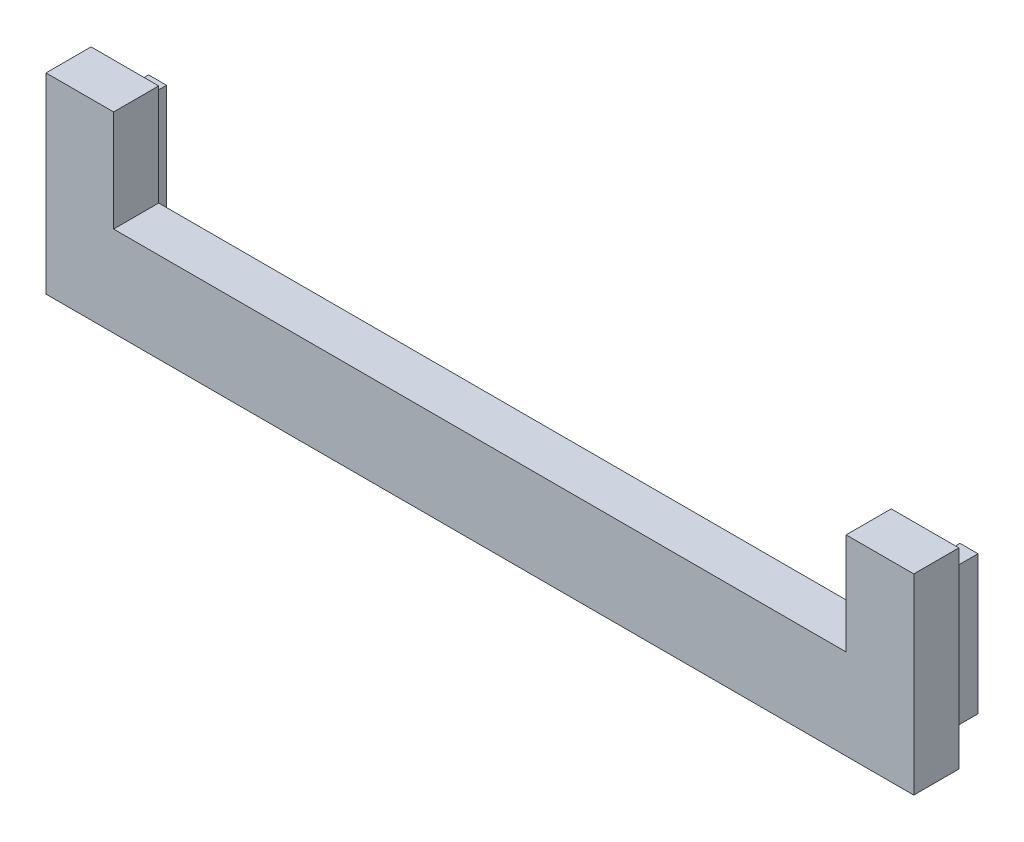
ISO-10303-21;
HEADER;
FILE_DESCRIPTION(('STEP AP214'),'2;1');
FILE_NAME('part.step','',(''),(''),'','','');
FILE_SCHEMA(('AUTOMOTIVE_DESIGN { 1 0 10303 214 1 1 1 1 }'));
ENDSEC;
DATA;
#1=APPLICATION_CONTEXT('core data for automotive mechanical design processes');
#2=APPLICATION_PROTOCOL_DEFINITION('international standard','automotive_design',2000,#1);
#3=PRODUCT_CONTEXT('',#1,'mechanical');
#4=PRODUCT('Part','Part','',(#3));
#5=PRODUCT_RELATED_PRODUCT_CATEGORY('part','',(#4));
#6=PRODUCT_DEFINITION_FORMATION('','',#4);
#7=PRODUCT_DEFINITION_CONTEXT('part definition',#1,'design');
#8=PRODUCT_DEFINITION('design','',#6,#7);
#9=PRODUCT_DEFINITION_SHAPE('','',#8);
#10=(LENGTH_UNIT() NAMED_UNIT(*) SI_UNIT(.MILLI.,.METRE.));
#11=(NAMED_UNIT(*) PLANE_ANGLE_UNIT() SI_UNIT($,.RADIAN.));
#12=(NAMED_UNIT(*) SI_UNIT($,.STERADIAN.) SOLID_ANGLE_UNIT());
#13=UNCERTAINTY_MEASURE_WITH_UNIT(LENGTH_MEASURE(1.E-05),#10,'distance_accuracy_value','');
#14=(GEOMETRIC_REPRESENTATION_CONTEXT(3) GLOBAL_UNCERTAINTY_ASSIGNED_CONTEXT((#13)) GLOBAL_UNIT_ASSIGNED_CONTEXT((#10,
#11,#12)) REPRESENTATION_CONTEXT('',''));
#15=CARTESIAN_POINT('',(0.,0.,0.));
#16=DIRECTION('',(0.,0.,1.));
#17=DIRECTION('',(1.,0.,0.));
#18=AXIS2_PLACEMENT_3D('',#15,#16,#17);
#19=CARTESIAN_POINT('',(-19.25,4.25,2.));
#20=DIRECTION('',(0.,1.,0.));
#21=DIRECTION('',(0.,0.,1.));
#22=AXIS2_PLACEMENT_3D('',#19,#20,#21);
#23=PLANE('',#22);
#24=DIRECTION('',(0.,0.,1.));
#25=VECTOR('',#24,1.);
#26=CARTESIAN_POINT('',(-16.25,4.25,-1.7));
#27=LINE('',#26,#25);
#28=CARTESIAN_POINT('',(-16.25,4.25,0.));
#29=VERTEX_POINT('',#28);
#30=CARTESIAN_POINT('',(-16.25,4.25,2.));
#31=VERTEX_POINT('',#30);
#32=EDGE_CURVE('E178',#29,#31,#27,.T.);
#33=ORIENTED_EDGE('',*,*,#32,.F.);
#34=DIRECTION('',(1.,0.,0.));
#35=VECTOR('',#34,1.);
#36=CARTESIAN_POINT('',(-19.25,4.25,0.));
#37=LINE('',#36,#35);
#38=CARTESIAN_POINT('',(-19.25,4.25,0.));
#39=VERTEX_POINT('',#38);
#40=EDGE_CURVE('E255',#39,#29,#37,.T.);
#41=ORIENTED_EDGE('',*,*,#40,.F.);
#42=DIRECTION('',(0.,0.,-1.));
#43=VECTOR('',#42,1.);
#44=CARTESIAN_POINT('',(-19.25,4.25,2.));
#45=LINE('',#44,#43);
#46=CARTESIAN_POINT('',(-19.25,4.25,2.));
#47=VERTEX_POINT('',#46);
#48=EDGE_CURVE('E263',#47,#39,#45,.T.);
#49=ORIENTED_EDGE('',*,*,#48,.F.);
#50=DIRECTION('',(1.,0.,0.));
#51=VECTOR('',#50,1.);
#52=CARTESIAN_POINT('',(-19.25,4.25,2.));
#53=LINE('',#52,#51);
#54=EDGE_CURVE('E260',#47,#31,#53,.T.);
#55=ORIENTED_EDGE('',*,*,#54,.T.);
#56=EDGE_LOOP('',(#33,#41,#49,#55));
#57=FACE_BOUND('',#56,.T.);
#58=ADVANCED_FACE('F39',(#57),#23,.T.);
#59=CARTESIAN_POINT('',(0.,0.,0.));
#60=DIRECTION('',(0.,0.,1.));
#61=DIRECTION('',(1.,0.,0.));
#62=AXIS2_PLACEMENT_3D('',#59,#60,#61);
#63=PLANE('',#62);
#64=ORIENTED_EDGE('',*,*,#40,.T.);
#65=DIRECTION('',(0.,-1.,0.));
#66=VECTOR('',#65,1.);
#67=CARTESIAN_POINT('',(-16.25,0.,0.));
#68=LINE('',#67,#66);
#69=CARTESIAN_POINT('',(-16.25,-0.250000000000001,0.));
#70=VERTEX_POINT('',#69);
#71=EDGE_CURVE('E184',#29,#70,#68,.T.);
#72=ORIENTED_EDGE('',*,*,#71,.T.);
#73=DIRECTION('',(1.,0.,0.));
#74=VECTOR('',#73,1.);
#75=CARTESIAN_POINT('',(0.,-0.250000000000001,0.));
#76=LINE('',#75,#74);
#77=CARTESIAN_POINT('',(16.25,-0.250000000000001,0.));
#78=VERTEX_POINT('',#77);
#79=EDGE_CURVE('E180',#70,#78,#76,.T.);
#80=ORIENTED_EDGE('',*,*,#79,.T.);
#81=DIRECTION('',(0.,1.,0.));
#82=VECTOR('',#81,1.);
#83=CARTESIAN_POINT('',(16.25,0.,0.));
#84=LINE('',#83,#82);
#85=CARTESIAN_POINT('',(16.25,4.25,0.));
#86=VERTEX_POINT('',#85);
#87=EDGE_CURVE('E159',#78,#86,#84,.T.);
#88=ORIENTED_EDGE('',*,*,#87,.T.);
#89=CARTESIAN_POINT('',(19.25,4.25,0.));
#90=VERTEX_POINT('',#89);
#91=EDGE_CURVE('E272',#86,#90,#37,.T.);
#92=ORIENTED_EDGE('',*,*,#91,.T.);
#93=DIRECTION('',(0.,-1.,0.));
#94=VECTOR('',#93,1.);
#95=CARTESIAN_POINT('',(19.25,4.25,0.));
#96=LINE('',#95,#94);
#97=CARTESIAN_POINT('',(19.25,-4.25,0.));
#98=VERTEX_POINT('',#97);
#99=EDGE_CURVE('E269',#90,#98,#96,.T.);
#100=ORIENTED_EDGE('',*,*,#99,.T.);
#101=DIRECTION('',(1.,0.,0.));
#102=VECTOR('',#101,1.);
#103=CARTESIAN_POINT('',(-19.25,-4.25,0.));
#104=LINE('',#103,#102);
#105=CARTESIAN_POINT('',(-19.25,-4.25,0.));
#106=VERTEX_POINT('',#105);
#107=EDGE_CURVE('E266',#106,#98,#104,.T.);
#108=ORIENTED_EDGE('',*,*,#107,.F.);
#109=DIRECTION('',(0.,-1.,0.));
#110=VECTOR('',#109,1.);
#111=CARTESIAN_POINT('',(-19.25,4.25,0.));
#112=LINE('',#111,#110);
#113=EDGE_CURVE('E250',#39,#106,#112,.T.);
#114=ORIENTED_EDGE('',*,*,#113,.F.);
#115=EDGE_LOOP('',(#64,#72,#80,#88,#92,#100,#108,#114));
#116=FACE_BOUND('',#115,.T.);
#117=DIRECTION('',(-1.,0.,0.));
#118=VECTOR('',#117,1.);
#119=CARTESIAN_POINT('',(-18.4,2.75,0.));
#120=LINE('',#119,#118);
#121=CARTESIAN_POINT('',(-17.6,2.75,0.));
#122=VERTEX_POINT('',#121);
#123=CARTESIAN_POINT('',(-18.4,2.75,0.));
#124=VERTEX_POINT('',#123);
#125=EDGE_CURVE('E204',#122,#124,#120,.T.);
#126=ORIENTED_EDGE('',*,*,#125,.T.);
#127=DIRECTION('',(0.,-1.,0.));
#128=VECTOR('',#127,1.);
#129=CARTESIAN_POINT('',(-18.4,2.75,0.));
#130=LINE('',#129,#128);
#131=CARTESIAN_POINT('',(-18.4,-3.4,0.));
#132=VERTEX_POINT('',#131);
#133=EDGE_CURVE('E187',#124,#132,#130,.T.);
#134=ORIENTED_EDGE('',*,*,#133,.T.);
#135=DIRECTION('',(1.,0.,0.));
#136=VECTOR('',#135,1.);
#137=CARTESIAN_POINT('',(-18.4,-3.4,0.));
#138=LINE('',#137,#136);
#139=CARTESIAN_POINT('',(-17.6,-3.4,0.));
#140=VERTEX_POINT('',#139);
#141=EDGE_CURVE('E192',#132,#140,#138,.T.);
#142=ORIENTED_EDGE('',*,*,#141,.T.);
#143=DIRECTION('',(0.,1.,0.));
#144=VECTOR('',#143,1.);
#145=CARTESIAN_POINT('',(-17.6,2.75,0.));
#146=LINE('',#145,#144);
#147=EDGE_CURVE('E62',#140,#122,#146,.T.);
#148=ORIENTED_EDGE('',*,*,#147,.T.);
#149=EDGE_LOOP('',(#126,#134,#142,#148));
#150=FACE_BOUND('',#149,.T.);
#151=DIRECTION('',(0.,-1.,0.));
#152=VECTOR('',#151,1.);
#153=CARTESIAN_POINT('',(18.4,2.75,0.));
#154=LINE('',#153,#152);
#155=CARTESIAN_POINT('',(18.4,2.75,0.));
#156=VERTEX_POINT('',#155);
#157=CARTESIAN_POINT('',(18.4,-3.4,0.));
#158=VERTEX_POINT('',#157);
#159=EDGE_CURVE('E217',#156,#158,#154,.T.);
#160=ORIENTED_EDGE('',*,*,#159,.F.);
#161=DIRECTION('',(1.,0.,0.));
#162=VECTOR('',#161,1.);
#163=CARTESIAN_POINT('',(18.4,2.75,0.));
#164=LINE('',#163,#162);
#165=CARTESIAN_POINT('',(17.6,2.75,0.));
#166=VERTEX_POINT('',#165);
#167=EDGE_CURVE('E222',#166,#156,#164,.T.);
#168=ORIENTED_EDGE('',*,*,#167,.F.);
#169=DIRECTION('',(0.,1.,0.));
#170=VECTOR('',#169,1.);
#171=CARTESIAN_POINT('',(17.6,2.75,0.));
#172=LINE('',#171,#170);
#173=CARTESIAN_POINT('',(17.6,-3.4,0.));
#174=VERTEX_POINT('',#173);
#175=EDGE_CURVE('E234',#174,#166,#172,.T.);
#176=ORIENTED_EDGE('',*,*,#175,.F.);
#177=DIRECTION('',(-1.,0.,0.));
#178=VECTOR('',#177,1.);
#179=CARTESIAN_POINT('',(18.4,-3.4,0.));
#180=LINE('',#179,#178);
#181=EDGE_CURVE('E231',#158,#174,#180,.T.);
#182=ORIENTED_EDGE('',*,*,#181,.F.);
#183=EDGE_LOOP('',(#160,#168,#176,#182));
#184=FACE_BOUND('',#183,.T.);
#185=ADVANCED_FACE('F288',(#116,#150,#184),#63,.F.);
#186=CARTESIAN_POINT('',(-19.25,4.25,2.));
#187=DIRECTION('',(1.,0.,0.));
#188=DIRECTION('',(0.,0.,-1.));
#189=AXIS2_PLACEMENT_3D('',#186,#187,#188);
#190=PLANE('',#189);
#191=ORIENTED_EDGE('',*,*,#113,.T.);
#192=DIRECTION('',(0.,0.,-1.));
#193=VECTOR('',#192,1.);
#194=CARTESIAN_POINT('',(-19.25,-4.25,2.));
#195=LINE('',#194,#193);
#196=CARTESIAN_POINT('',(-19.25,-4.25,2.));
#197=VERTEX_POINT('',#196);
#198=EDGE_CURVE('E11',#197,#106,#195,.T.);
#199=ORIENTED_EDGE('',*,*,#198,.F.);
#200=DIRECTION('',(0.,-1.,0.));
#201=VECTOR('',#200,1.);
#202=CARTESIAN_POINT('',(-19.25,4.25,2.));
#203=LINE('',#202,#201);
#204=EDGE_CURVE('E251',#47,#197,#203,.T.);
#205=ORIENTED_EDGE('',*,*,#204,.F.);
#206=ORIENTED_EDGE('',*,*,#48,.T.);
#207=EDGE_LOOP('',(#191,#199,#205,#206));
#208=FACE_BOUND('',#207,.T.);
#209=ADVANCED_FACE('F41',(#208),#190,.F.);
#210=CARTESIAN_POINT('',(-19.25,-4.25,2.));
#211=DIRECTION('',(0.,1.,0.));
#212=DIRECTION('',(0.,0.,1.));
#213=AXIS2_PLACEMENT_3D('',#210,#211,#212);
#214=PLANE('',#213);
#215=ORIENTED_EDGE('',*,*,#107,.T.);
#216=DIRECTION('',(0.,0.,-1.));
#217=VECTOR('',#216,1.);
#218=CARTESIAN_POINT('',(19.25,-4.25,2.));
#219=LINE('',#218,#217);
#220=CARTESIAN_POINT('',(19.25,-4.25,2.));
#221=VERTEX_POINT('',#220);
#222=EDGE_CURVE('E47',#221,#98,#219,.T.);
#223=ORIENTED_EDGE('',*,*,#222,.F.);
#224=DIRECTION('',(1.,0.,0.));
#225=VECTOR('',#224,1.);
#226=CARTESIAN_POINT('',(-19.25,-4.25,2.));
#227=LINE('',#226,#225);
#228=EDGE_CURVE('E254',#197,#221,#227,.T.);
#229=ORIENTED_EDGE('',*,*,#228,.F.);
#230=ORIENTED_EDGE('',*,*,#198,.T.);
#231=EDGE_LOOP('',(#215,#223,#229,#230));
#232=FACE_BOUND('',#231,.T.);
#233=ADVANCED_FACE('F284',(#232),#214,.F.);
#234=CARTESIAN_POINT('',(19.25,4.25,2.));
#235=DIRECTION('',(1.,0.,0.));
#236=DIRECTION('',(0.,0.,-1.));
#237=AXIS2_PLACEMENT_3D('',#234,#235,#236);
#238=PLANE('',#237);
#239=ORIENTED_EDGE('',*,*,#99,.F.);
#240=DIRECTION('',(0.,0.,-1.));
#241=VECTOR('',#240,1.);
#242=CARTESIAN_POINT('',(19.25,4.25,2.));
#243=LINE('',#242,#241);
#244=CARTESIAN_POINT('',(19.25,4.25,2.));
#245=VERTEX_POINT('',#244);
#246=EDGE_CURVE('E276',#245,#90,#243,.T.);
#247=ORIENTED_EDGE('',*,*,#246,.F.);
#248=DIRECTION('',(0.,-1.,0.));
#249=VECTOR('',#248,1.);
#250=CARTESIAN_POINT('',(19.25,4.25,2.));
#251=LINE('',#250,#249);
#252=EDGE_CURVE('E257',#245,#221,#251,.T.);
#253=ORIENTED_EDGE('',*,*,#252,.T.);
#254=ORIENTED_EDGE('',*,*,#222,.T.);
#255=EDGE_LOOP('',(#239,#247,#253,#254));
#256=FACE_BOUND('',#255,.T.);
#257=ADVANCED_FACE('F281',(#256),#238,.T.);
#258=DIRECTION('',(0.,0.,1.));
#259=VECTOR('',#258,1.);
#260=CARTESIAN_POINT('',(16.25,4.25,-1.7));
#261=LINE('',#260,#259);
#262=CARTESIAN_POINT('',(16.25,4.25,2.));
#263=VERTEX_POINT('',#262);
#264=EDGE_CURVE('E162',#86,#263,#261,.T.);
#265=ORIENTED_EDGE('',*,*,#264,.T.);
#266=EDGE_CURVE('E173',#263,#245,#53,.T.);
#267=ORIENTED_EDGE('',*,*,#266,.T.);
#268=ORIENTED_EDGE('',*,*,#246,.T.);
#269=ORIENTED_EDGE('',*,*,#91,.F.);
#270=EDGE_LOOP('',(#265,#267,#268,#269));
#271=FACE_BOUND('',#270,.T.);
#272=ADVANCED_FACE('F292',(#271),#23,.T.);
#273=CARTESIAN_POINT('',(0.,0.,2.));
#274=DIRECTION('',(0.,0.,1.));
#275=DIRECTION('',(1.,0.,0.));
#276=AXIS2_PLACEMENT_3D('',#273,#274,#275);
#277=PLANE('',#276);
#278=DIRECTION('',(0.,-1.,0.));
#279=VECTOR('',#278,1.);
#280=CARTESIAN_POINT('',(-16.25,4.25,2.));
#281=LINE('',#280,#279);
#282=CARTESIAN_POINT('',(-16.25,-0.250000000000001,2.));
#283=VERTEX_POINT('',#282);
#284=EDGE_CURVE('E54',#31,#283,#281,.T.);
#285=ORIENTED_EDGE('',*,*,#284,.F.);
#286=ORIENTED_EDGE('',*,*,#54,.F.);
#287=ORIENTED_EDGE('',*,*,#204,.T.);
#288=ORIENTED_EDGE('',*,*,#228,.T.);
#289=ORIENTED_EDGE('',*,*,#252,.F.);
#290=ORIENTED_EDGE('',*,*,#266,.F.);
#291=DIRECTION('',(0.,1.,0.));
#292=VECTOR('',#291,1.);
#293=CARTESIAN_POINT('',(16.25,4.25,2.));
#294=LINE('',#293,#292);
#295=CARTESIAN_POINT('',(16.25,-0.250000000000001,2.));
#296=VERTEX_POINT('',#295);
#297=EDGE_CURVE('E156',#296,#263,#294,.T.);
#298=ORIENTED_EDGE('',*,*,#297,.F.);
#299=DIRECTION('',(1.,0.,0.));
#300=VECTOR('',#299,1.);
#301=CARTESIAN_POINT('',(-16.25,-0.250000000000001,2.));
#302=LINE('',#301,#300);
#303=EDGE_CURVE('E166',#283,#296,#302,.T.);
#304=ORIENTED_EDGE('',*,*,#303,.F.);
#305=EDGE_LOOP('',(#285,#286,#287,#288,#289,#290,#298,#304));
#306=FACE_BOUND('',#305,.T.);
#307=ADVANCED_FACE('F171',(#306),#277,.T.);
#308=CARTESIAN_POINT('',(18.4,2.75,-1.7));
#309=DIRECTION('',(-1.,0.,0.));
#310=DIRECTION('',(0.,0.,1.));
#311=AXIS2_PLACEMENT_3D('',#308,#309,#310);
#312=PLANE('',#311);
#313=ORIENTED_EDGE('',*,*,#159,.T.);
#314=DIRECTION('',(0.,0.,1.));
#315=VECTOR('',#314,1.);
#316=CARTESIAN_POINT('',(18.4,-3.4,-1.7));
#317=LINE('',#316,#315);
#318=CARTESIAN_POINT('',(18.4,-3.4,-1.7));
#319=VERTEX_POINT('',#318);
#320=EDGE_CURVE('E247',#319,#158,#317,.T.);
#321=ORIENTED_EDGE('',*,*,#320,.F.);
#322=DIRECTION('',(0.,-1.,0.));
#323=VECTOR('',#322,1.);
#324=CARTESIAN_POINT('',(18.4,2.75,-1.7));
#325=LINE('',#324,#323);
#326=CARTESIAN_POINT('',(18.4,2.75,-1.7));
#327=VERTEX_POINT('',#326);
#328=EDGE_CURVE('E218',#327,#319,#325,.T.);
#329=ORIENTED_EDGE('',*,*,#328,.F.);
#330=DIRECTION('',(0.,0.,1.));
#331=VECTOR('',#330,1.);
#332=CARTESIAN_POINT('',(18.4,2.75,-1.7));
#333=LINE('',#332,#331);
#334=EDGE_CURVE('E228',#327,#156,#333,.T.);
#335=ORIENTED_EDGE('',*,*,#334,.T.);
#336=EDGE_LOOP('',(#313,#321,#329,#335));
#337=FACE_BOUND('',#336,.T.);
#338=ADVANCED_FACE('F323',(#337),#312,.F.);
#339=CARTESIAN_POINT('',(18.4,-3.4,-1.7));
#340=DIRECTION('',(0.,1.,0.));
#341=DIRECTION('',(-1.,0.,0.));
#342=AXIS2_PLACEMENT_3D('',#339,#340,#341);
#343=PLANE('',#342);
#344=ORIENTED_EDGE('',*,*,#181,.T.);
#345=DIRECTION('',(0.,0.,1.));
#346=VECTOR('',#345,1.);
#347=CARTESIAN_POINT('',(17.6,-3.4,-1.7));
#348=LINE('',#347,#346);
#349=CARTESIAN_POINT('',(17.6,-3.4,-1.7));
#350=VERTEX_POINT('',#349);
#351=EDGE_CURVE('E244',#350,#174,#348,.T.);
#352=ORIENTED_EDGE('',*,*,#351,.F.);
#353=DIRECTION('',(-1.,0.,0.));
#354=VECTOR('',#353,1.);
#355=CARTESIAN_POINT('',(18.4,-3.4,-1.7));
#356=LINE('',#355,#354);
#357=EDGE_CURVE('E221',#319,#350,#356,.T.);
#358=ORIENTED_EDGE('',*,*,#357,.F.);
#359=ORIENTED_EDGE('',*,*,#320,.T.);
#360=EDGE_LOOP('',(#344,#352,#358,#359));
#361=FACE_BOUND('',#360,.T.);
#362=ADVANCED_FACE('F367',(#361),#343,.F.);
#363=CARTESIAN_POINT('',(17.6,2.75,-1.7));
#364=DIRECTION('',(1.,0.,0.));
#365=DIRECTION('',(0.,0.,-1.));
#366=AXIS2_PLACEMENT_3D('',#363,#364,#365);
#367=PLANE('',#366);
#368=ORIENTED_EDGE('',*,*,#175,.T.);
#369=DIRECTION('',(0.,0.,1.));
#370=VECTOR('',#369,1.);
#371=CARTESIAN_POINT('',(17.6,2.75,-1.7));
#372=LINE('',#371,#370);
#373=CARTESIAN_POINT('',(17.6,2.75,-1.7));
#374=VERTEX_POINT('',#373);
#375=EDGE_CURVE('E241',#374,#166,#372,.T.);
#376=ORIENTED_EDGE('',*,*,#375,.F.);
#377=DIRECTION('',(0.,1.,0.));
#378=VECTOR('',#377,1.);
#379=CARTESIAN_POINT('',(17.6,2.75,-1.7));
#380=LINE('',#379,#378);
#381=EDGE_CURVE('E224',#350,#374,#380,.T.);
#382=ORIENTED_EDGE('',*,*,#381,.F.);
#383=ORIENTED_EDGE('',*,*,#351,.T.);
#384=EDGE_LOOP('',(#368,#376,#382,#383));
#385=FACE_BOUND('',#384,.T.);
#386=ADVANCED_FACE('F377',(#385),#367,.F.);
#387=CARTESIAN_POINT('',(18.4,2.75,-1.7));
#388=DIRECTION('',(0.,-1.,0.));
#389=DIRECTION('',(0.,0.,-1.));
#390=AXIS2_PLACEMENT_3D('',#387,#388,#389);
#391=PLANE('',#390);
#392=ORIENTED_EDGE('',*,*,#167,.T.);
#393=ORIENTED_EDGE('',*,*,#334,.F.);
#394=DIRECTION('',(1.,0.,0.));
#395=VECTOR('',#394,1.);
#396=CARTESIAN_POINT('',(18.4,2.75,-1.7));
#397=LINE('',#396,#395);
#398=EDGE_CURVE('E226',#374,#327,#397,.T.);
#399=ORIENTED_EDGE('',*,*,#398,.F.);
#400=ORIENTED_EDGE('',*,*,#375,.T.);
#401=EDGE_LOOP('',(#392,#393,#399,#400));
#402=FACE_BOUND('',#401,.T.);
#403=ADVANCED_FACE('F387',(#402),#391,.F.);
#404=CARTESIAN_POINT('',(0.,0.,-1.7));
#405=DIRECTION('',(0.,0.,-1.));
#406=DIRECTION('',(-1.,0.,0.));
#407=AXIS2_PLACEMENT_3D('',#404,#405,#406);
#408=PLANE('',#407);
#409=ORIENTED_EDGE('',*,*,#328,.T.);
#410=ORIENTED_EDGE('',*,*,#357,.T.);
#411=ORIENTED_EDGE('',*,*,#381,.T.);
#412=ORIENTED_EDGE('',*,*,#398,.T.);
#413=EDGE_LOOP('',(#409,#410,#411,#412));
#414=FACE_BOUND('',#413,.T.);
#415=ADVANCED_FACE('F397',(#414),#408,.T.);
#416=CARTESIAN_POINT('',(-18.4,2.75,-1.7));
#417=DIRECTION('',(-1.,0.,0.));
#418=DIRECTION('',(0.,0.,1.));
#419=AXIS2_PLACEMENT_3D('',#416,#417,#418);
#420=PLANE('',#419);
#421=ORIENTED_EDGE('',*,*,#133,.F.);
#422=DIRECTION('',(0.,0.,1.));
#423=VECTOR('',#422,1.);
#424=CARTESIAN_POINT('',(-18.4,2.75,-1.7));
#425=LINE('',#424,#423);
#426=CARTESIAN_POINT('',(-18.4,2.75,-1.7));
#427=VERTEX_POINT('',#426);
#428=EDGE_CURVE('E215',#427,#124,#425,.T.);
#429=ORIENTED_EDGE('',*,*,#428,.F.);
#430=DIRECTION('',(0.,-1.,0.));
#431=VECTOR('',#430,1.);
#432=CARTESIAN_POINT('',(-18.4,2.75,-1.7));
#433=LINE('',#432,#431);
#434=CARTESIAN_POINT('',(-18.4,-3.4,-1.7));
#435=VERTEX_POINT('',#434);
#436=EDGE_CURVE('E188',#427,#435,#433,.T.);
#437=ORIENTED_EDGE('',*,*,#436,.T.);
#438=DIRECTION('',(0.,0.,1.));
#439=VECTOR('',#438,1.);
#440=CARTESIAN_POINT('',(-18.4,-3.4,-1.7));
#441=LINE('',#440,#439);
#442=EDGE_CURVE('E201',#435,#132,#441,.T.);
#443=ORIENTED_EDGE('',*,*,#442,.T.);
#444=EDGE_LOOP('',(#421,#429,#437,#443));
#445=FACE_BOUND('',#444,.T.);
#446=ADVANCED_FACE('F407',(#445),#420,.T.);
#447=CARTESIAN_POINT('',(-18.4,2.75,-1.7));
#448=DIRECTION('',(0.,1.,0.));
#449=DIRECTION('',(0.,0.,1.));
#450=AXIS2_PLACEMENT_3D('',#447,#448,#449);
#451=PLANE('',#450);
#452=ORIENTED_EDGE('',*,*,#125,.F.);
#453=DIRECTION('',(0.,0.,1.));
#454=VECTOR('',#453,1.);
#455=CARTESIAN_POINT('',(-17.6,2.75,-1.7));
#456=LINE('',#455,#454);
#457=CARTESIAN_POINT('',(-17.6,2.75,-1.7));
#458=VERTEX_POINT('',#457);
#459=EDGE_CURVE('E213',#458,#122,#456,.T.);
#460=ORIENTED_EDGE('',*,*,#459,.F.);
#461=DIRECTION('',(-1.,0.,0.));
#462=VECTOR('',#461,1.);
#463=CARTESIAN_POINT('',(-18.4,2.75,-1.7));
#464=LINE('',#463,#462);
#465=EDGE_CURVE('E191',#458,#427,#464,.T.);
#466=ORIENTED_EDGE('',*,*,#465,.T.);
#467=ORIENTED_EDGE('',*,*,#428,.T.);
#468=EDGE_LOOP('',(#452,#460,#466,#467));
#469=FACE_BOUND('',#468,.T.);
#470=ADVANCED_FACE('F417',(#469),#451,.T.);
#471=CARTESIAN_POINT('',(-17.6,2.75,-1.7));
#472=DIRECTION('',(1.,0.,0.));
#473=DIRECTION('',(0.,0.,-1.));
#474=AXIS2_PLACEMENT_3D('',#471,#472,#473);
#475=PLANE('',#474);
#476=ORIENTED_EDGE('',*,*,#147,.F.);
#477=DIRECTION('',(0.,0.,1.));
#478=VECTOR('',#477,1.);
#479=CARTESIAN_POINT('',(-17.6,-3.4,-1.7));
#480=LINE('',#479,#478);
#481=CARTESIAN_POINT('',(-17.6,-3.4,-1.7));
#482=VERTEX_POINT('',#481);
#483=EDGE_CURVE('E211',#482,#140,#480,.T.);
#484=ORIENTED_EDGE('',*,*,#483,.F.);
#485=DIRECTION('',(0.,1.,0.));
#486=VECTOR('',#485,1.);
#487=CARTESIAN_POINT('',(-17.6,2.75,-1.7));
#488=LINE('',#487,#486);
#489=EDGE_CURVE('E195',#482,#458,#488,.T.);
#490=ORIENTED_EDGE('',*,*,#489,.T.);
#491=ORIENTED_EDGE('',*,*,#459,.T.);
#492=EDGE_LOOP('',(#476,#484,#490,#491));
#493=FACE_BOUND('',#492,.T.);
#494=ADVANCED_FACE('F427',(#493),#475,.T.);
#495=CARTESIAN_POINT('',(-18.4,-3.4,-1.7));
#496=DIRECTION('',(0.,-1.,0.));
#497=DIRECTION('',(1.,0.,0.));
#498=AXIS2_PLACEMENT_3D('',#495,#496,#497);
#499=PLANE('',#498);
#500=ORIENTED_EDGE('',*,*,#141,.F.);
#501=ORIENTED_EDGE('',*,*,#442,.F.);
#502=DIRECTION('',(1.,0.,0.));
#503=VECTOR('',#502,1.);
#504=CARTESIAN_POINT('',(-18.4,-3.4,-1.7));
#505=LINE('',#504,#503);
#506=EDGE_CURVE('E198',#435,#482,#505,.T.);
#507=ORIENTED_EDGE('',*,*,#506,.T.);
#508=ORIENTED_EDGE('',*,*,#483,.T.);
#509=EDGE_LOOP('',(#500,#501,#507,#508));
#510=FACE_BOUND('',#509,.T.);
#511=ADVANCED_FACE('F309',(#510),#499,.T.);
#512=CARTESIAN_POINT('',(0.,0.,-1.7));
#513=DIRECTION('',(0.,0.,-1.));
#514=DIRECTION('',(1.,0.,0.));
#515=AXIS2_PLACEMENT_3D('',#512,#513,#514);
#516=PLANE('',#515);
#517=ORIENTED_EDGE('',*,*,#436,.F.);
#518=ORIENTED_EDGE('',*,*,#465,.F.);
#519=ORIENTED_EDGE('',*,*,#489,.F.);
#520=ORIENTED_EDGE('',*,*,#506,.F.);
#521=EDGE_LOOP('',(#517,#518,#519,#520));
#522=FACE_BOUND('',#521,.T.);
#523=ADVANCED_FACE('F301',(#522),#516,.T.);
#524=CARTESIAN_POINT('',(-16.25,4.25,-1.7));
#525=DIRECTION('',(-1.,0.,0.));
#526=DIRECTION('',(0.,0.,1.));
#527=AXIS2_PLACEMENT_3D('',#524,#525,#526);
#528=PLANE('',#527);
#529=ORIENTED_EDGE('',*,*,#32,.T.);
#530=ORIENTED_EDGE('',*,*,#284,.T.);
#531=DIRECTION('',(0.,0.,1.));
#532=VECTOR('',#531,1.);
#533=CARTESIAN_POINT('',(-16.25,-0.250000000000001,-1.7));
#534=LINE('',#533,#532);
#535=EDGE_CURVE('E163',#70,#283,#534,.T.);
#536=ORIENTED_EDGE('',*,*,#535,.F.);
#537=ORIENTED_EDGE('',*,*,#71,.F.);
#538=EDGE_LOOP('',(#529,#530,#536,#537));
#539=FACE_BOUND('',#538,.T.);
#540=ADVANCED_FACE('F299',(#539),#528,.F.);
#541=CARTESIAN_POINT('',(16.25,4.25,-1.7));
#542=DIRECTION('',(1.,0.,0.));
#543=DIRECTION('',(0.,0.,-1.));
#544=AXIS2_PLACEMENT_3D('',#541,#542,#543);
#545=PLANE('',#544);
#546=DIRECTION('',(0.,0.,1.));
#547=VECTOR('',#546,1.);
#548=CARTESIAN_POINT('',(16.25,-0.250000000000001,-1.7));
#549=LINE('',#548,#547);
#550=EDGE_CURVE('E152',#78,#296,#549,.T.);
#551=ORIENTED_EDGE('',*,*,#550,.T.);
#552=ORIENTED_EDGE('',*,*,#297,.T.);
#553=ORIENTED_EDGE('',*,*,#264,.F.);
#554=ORIENTED_EDGE('',*,*,#87,.F.);
#555=EDGE_LOOP('',(#551,#552,#553,#554));
#556=FACE_BOUND('',#555,.T.);
#557=ADVANCED_FACE('F154',(#556),#545,.F.);
#558=CARTESIAN_POINT('',(-16.25,-0.250000000000001,-1.7));
#559=DIRECTION('',(0.,-1.,0.));
#560=DIRECTION('',(0.,0.,-1.));
#561=AXIS2_PLACEMENT_3D('',#558,#559,#560);
#562=PLANE('',#561);
#563=ORIENTED_EDGE('',*,*,#535,.T.);
#564=ORIENTED_EDGE('',*,*,#303,.T.);
#565=ORIENTED_EDGE('',*,*,#550,.F.);
#566=ORIENTED_EDGE('',*,*,#79,.F.);
#567=EDGE_LOOP('',(#563,#564,#565,#566));
#568=FACE_BOUND('',#567,.T.);
#569=ADVANCED_FACE('F167',(#568),#562,.F.);
#570=CLOSED_SHELL('',(#58,#185,#209,#233,#257,#272,#307,#338,#362,#386,#403,#415,#446,#470,#494,
#511,#523,#540,#557,#569));
#571=MANIFOLD_SOLID_BREP('B2',#570);
#572=ADVANCED_BREP_SHAPE_REPRESENTATION('',(#18,#571),#14);
#573=SHAPE_DEFINITION_REPRESENTATION(#9,#572);
ENDSEC;
END-ISO-10303-21;
